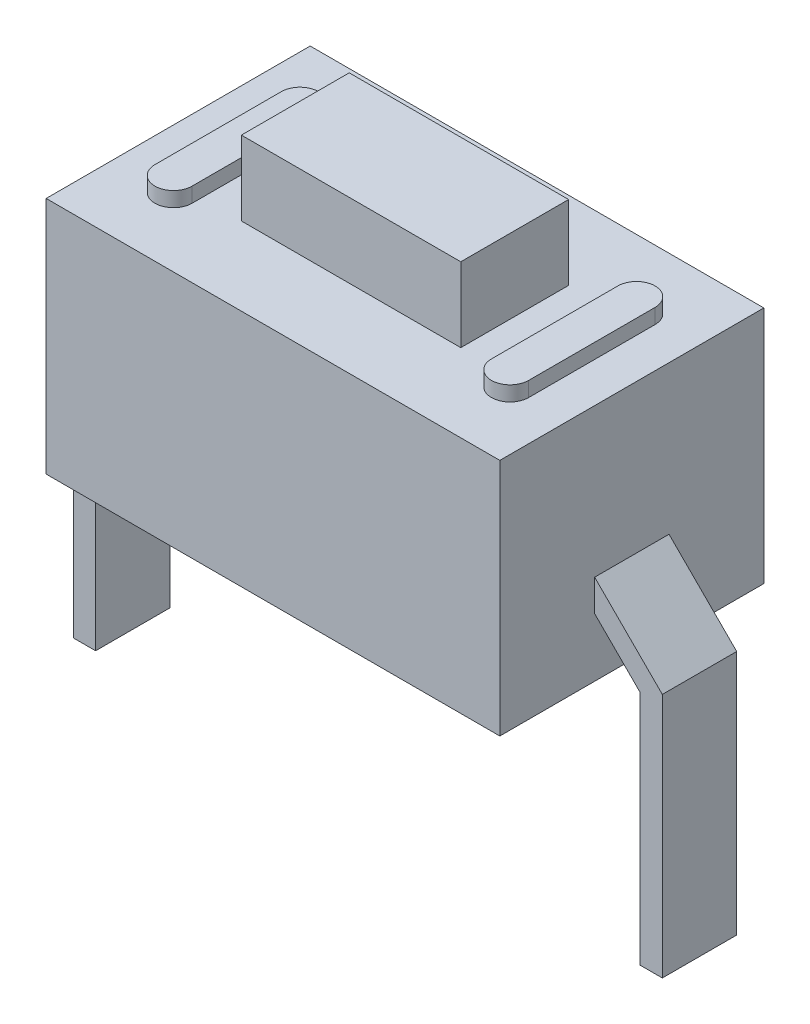
ISO-10303-21;
HEADER;
FILE_DESCRIPTION(('STEP AP214'),'2;1');
FILE_NAME('part.step','',(''),(''),'','','');
FILE_SCHEMA(('AUTOMOTIVE_DESIGN { 1 0 10303 214 1 1 1 1 }'));
ENDSEC;
DATA;
#1=APPLICATION_CONTEXT('core data for automotive mechanical design processes');
#2=APPLICATION_PROTOCOL_DEFINITION('international standard','automotive_design',2000,#1);
#3=PRODUCT_CONTEXT('',#1,'mechanical');
#4=PRODUCT('Part','Part','',(#3));
#5=PRODUCT_RELATED_PRODUCT_CATEGORY('part','',(#4));
#6=PRODUCT_DEFINITION_FORMATION('','',#4);
#7=PRODUCT_DEFINITION_CONTEXT('part definition',#1,'design');
#8=PRODUCT_DEFINITION('design','',#6,#7);
#9=PRODUCT_DEFINITION_SHAPE('','',#8);
#10=(LENGTH_UNIT() NAMED_UNIT(*) SI_UNIT(.MILLI.,.METRE.));
#11=(NAMED_UNIT(*) PLANE_ANGLE_UNIT() SI_UNIT($,.RADIAN.));
#12=(NAMED_UNIT(*) SI_UNIT($,.STERADIAN.) SOLID_ANGLE_UNIT());
#13=UNCERTAINTY_MEASURE_WITH_UNIT(LENGTH_MEASURE(1.E-05),#10,'distance_accuracy_value','');
#14=(GEOMETRIC_REPRESENTATION_CONTEXT(3) GLOBAL_UNCERTAINTY_ASSIGNED_CONTEXT((#13)) GLOBAL_UNIT_ASSIGNED_CONTEXT((#10,
#11,#12)) REPRESENTATION_CONTEXT('',''));
#15=CARTESIAN_POINT('',(0.,0.,0.));
#16=DIRECTION('',(0.,0.,1.));
#17=DIRECTION('',(1.,0.,0.));
#18=AXIS2_PLACEMENT_3D('',#15,#16,#17);
#19=CARTESIAN_POINT('',(-3.05,3.21,-1.775));
#20=DIRECTION('',(1.,0.,0.));
#21=DIRECTION('',(0.,0.,-1.));
#22=AXIS2_PLACEMENT_3D('',#19,#20,#21);
#23=PLANE('',#22);
#24=DIRECTION('',(0.,0.,1.));
#25=VECTOR('',#24,1.);
#26=CARTESIAN_POINT('',(-3.05,0.,-1.775));
#27=LINE('',#26,#25);
#28=CARTESIAN_POINT('',(-3.05,0.,-1.775));
#29=VERTEX_POINT('',#28);
#30=CARTESIAN_POINT('',(-3.05,0.,1.775));
#31=VERTEX_POINT('',#30);
#32=EDGE_CURVE('E408',#29,#31,#27,.T.);
#33=ORIENTED_EDGE('',*,*,#32,.T.);
#34=DIRECTION('',(0.,-1.,0.));
#35=VECTOR('',#34,1.);
#36=CARTESIAN_POINT('',(-3.05,3.21,1.775));
#37=LINE('',#36,#35);
#38=CARTESIAN_POINT('',(-3.05,3.21,1.775));
#39=VERTEX_POINT('',#38);
#40=EDGE_CURVE('E413',#39,#31,#37,.T.);
#41=ORIENTED_EDGE('',*,*,#40,.F.);
#42=DIRECTION('',(0.,0.,1.));
#43=VECTOR('',#42,1.);
#44=CARTESIAN_POINT('',(-3.05,3.21,-1.775));
#45=LINE('',#44,#43);
#46=CARTESIAN_POINT('',(-3.05,3.21,-1.775));
#47=VERTEX_POINT('',#46);
#48=EDGE_CURVE('E399',#47,#39,#45,.T.);
#49=ORIENTED_EDGE('',*,*,#48,.F.);
#50=DIRECTION('',(0.,-1.,0.));
#51=VECTOR('',#50,1.);
#52=CARTESIAN_POINT('',(-3.05,3.21,-1.775));
#53=LINE('',#52,#51);
#54=EDGE_CURVE('E416',#47,#29,#53,.T.);
#55=ORIENTED_EDGE('',*,*,#54,.T.);
#56=EDGE_LOOP('',(#33,#41,#49,#55));
#57=FACE_BOUND('',#56,.T.);
#58=DIRECTION('',(0.,1.,0.));
#59=VECTOR('',#58,1.);
#60=CARTESIAN_POINT('',(-3.05,3.21,0.5));
#61=LINE('',#60,#59);
#62=CARTESIAN_POINT('',(-3.05,0.787867965644037,0.5));
#63=VERTEX_POINT('',#62);
#64=CARTESIAN_POINT('',(-3.05,1.21213203435596,0.5));
#65=VERTEX_POINT('',#64);
#66=EDGE_CURVE('E11',#63,#65,#61,.T.);
#67=ORIENTED_EDGE('',*,*,#66,.F.);
#68=DIRECTION('',(0.,0.,-1.));
#69=VECTOR('',#68,1.);
#70=CARTESIAN_POINT('',(-3.05,0.787867965644036,-1.775));
#71=LINE('',#70,#69);
#72=CARTESIAN_POINT('',(-3.05,0.787867965644036,-0.5));
#73=VERTEX_POINT('',#72);
#74=EDGE_CURVE('E45',#63,#73,#71,.T.);
#75=ORIENTED_EDGE('',*,*,#74,.T.);
#76=DIRECTION('',(0.,1.,0.));
#77=VECTOR('',#76,1.);
#78=CARTESIAN_POINT('',(-3.05,3.21,-0.5));
#79=LINE('',#78,#77);
#80=CARTESIAN_POINT('',(-3.05,1.21213203435596,-0.5));
#81=VERTEX_POINT('',#80);
#82=EDGE_CURVE('E432',#73,#81,#79,.T.);
#83=ORIENTED_EDGE('',*,*,#82,.T.);
#84=DIRECTION('',(0.,0.,-1.));
#85=VECTOR('',#84,1.);
#86=CARTESIAN_POINT('',(-3.05,1.21213203435596,-1.775));
#87=LINE('',#86,#85);
#88=EDGE_CURVE('E435',#65,#81,#87,.T.);
#89=ORIENTED_EDGE('',*,*,#88,.F.);
#90=EDGE_LOOP('',(#67,#75,#83,#89));
#91=FACE_BOUND('',#90,.T.);
#92=ADVANCED_FACE('F37',(#57,#91),#23,.F.);
#93=CARTESIAN_POINT('',(3.05,3.21,-1.775));
#94=DIRECTION('',(-1.,0.,0.));
#95=DIRECTION('',(0.,0.,1.));
#96=AXIS2_PLACEMENT_3D('',#93,#94,#95);
#97=PLANE('',#96);
#98=DIRECTION('',(0.,0.,-1.));
#99=VECTOR('',#98,1.);
#100=CARTESIAN_POINT('',(3.05,0.,-1.775));
#101=LINE('',#100,#99);
#102=CARTESIAN_POINT('',(3.05,0.,1.775));
#103=VERTEX_POINT('',#102);
#104=CARTESIAN_POINT('',(3.05,0.,-1.775));
#105=VERTEX_POINT('',#104);
#106=EDGE_CURVE('E392',#103,#105,#101,.T.);
#107=ORIENTED_EDGE('',*,*,#106,.T.);
#108=DIRECTION('',(0.,-1.,0.));
#109=VECTOR('',#108,1.);
#110=CARTESIAN_POINT('',(3.05,3.21,-1.775));
#111=LINE('',#110,#109);
#112=CARTESIAN_POINT('',(3.05,3.21,-1.775));
#113=VERTEX_POINT('',#112);
#114=EDGE_CURVE('E419',#113,#105,#111,.T.);
#115=ORIENTED_EDGE('',*,*,#114,.F.);
#116=DIRECTION('',(0.,0.,-1.));
#117=VECTOR('',#116,1.);
#118=CARTESIAN_POINT('',(3.05,3.21,-1.775));
#119=LINE('',#118,#117);
#120=CARTESIAN_POINT('',(3.05,3.21,1.775));
#121=VERTEX_POINT('',#120);
#122=EDGE_CURVE('E393',#121,#113,#119,.T.);
#123=ORIENTED_EDGE('',*,*,#122,.F.);
#124=DIRECTION('',(0.,-1.,0.));
#125=VECTOR('',#124,1.);
#126=CARTESIAN_POINT('',(3.05,3.21,1.775));
#127=LINE('',#126,#125);
#128=EDGE_CURVE('E403',#121,#103,#127,.T.);
#129=ORIENTED_EDGE('',*,*,#128,.T.);
#130=EDGE_LOOP('',(#107,#115,#123,#129));
#131=FACE_BOUND('',#130,.T.);
#132=DIRECTION('',(0.,-1.,0.));
#133=VECTOR('',#132,1.);
#134=CARTESIAN_POINT('',(3.05,3.21,0.5));
#135=LINE('',#134,#133);
#136=CARTESIAN_POINT('',(3.05,1.21213203435596,0.5));
#137=VERTEX_POINT('',#136);
#138=CARTESIAN_POINT('',(3.05,0.787867965644037,0.5));
#139=VERTEX_POINT('',#138);
#140=EDGE_CURVE('E430',#137,#139,#135,.T.);
#141=ORIENTED_EDGE('',*,*,#140,.F.);
#142=DIRECTION('',(0.,0.,-1.));
#143=VECTOR('',#142,1.);
#144=CARTESIAN_POINT('',(3.05,1.21213203435596,-1.775));
#145=LINE('',#144,#143);
#146=CARTESIAN_POINT('',(3.05,1.21213203435596,-0.5));
#147=VERTEX_POINT('',#146);
#148=EDGE_CURVE('E427',#137,#147,#145,.T.);
#149=ORIENTED_EDGE('',*,*,#148,.T.);
#150=DIRECTION('',(0.,-1.,0.));
#151=VECTOR('',#150,1.);
#152=CARTESIAN_POINT('',(3.05,3.21,-0.5));
#153=LINE('',#152,#151);
#154=CARTESIAN_POINT('',(3.05,0.787867965644037,-0.5));
#155=VERTEX_POINT('',#154);
#156=EDGE_CURVE('E422',#147,#155,#153,.T.);
#157=ORIENTED_EDGE('',*,*,#156,.T.);
#158=DIRECTION('',(0.,0.,-1.));
#159=VECTOR('',#158,1.);
#160=CARTESIAN_POINT('',(3.05,0.787867965644038,-1.775));
#161=LINE('',#160,#159);
#162=EDGE_CURVE('E425',#139,#155,#161,.T.);
#163=ORIENTED_EDGE('',*,*,#162,.F.);
#164=EDGE_LOOP('',(#141,#149,#157,#163));
#165=FACE_BOUND('',#164,.T.);
#166=ADVANCED_FACE('F39',(#131,#165),#97,.F.);
#167=CARTESIAN_POINT('',(0.,3.21,0.));
#168=DIRECTION('',(0.,1.,0.));
#169=DIRECTION('',(0.,0.,1.));
#170=AXIS2_PLACEMENT_3D('',#167,#168,#169);
#171=PLANE('',#170);
#172=DIRECTION('',(0.,0.,-1.));
#173=VECTOR('',#172,1.);
#174=CARTESIAN_POINT('',(1.475,3.21,-0.725));
#175=LINE('',#174,#173);
#176=CARTESIAN_POINT('',(1.475,3.21,0.725));
#177=VERTEX_POINT('',#176);
#178=CARTESIAN_POINT('',(1.475,3.21,-0.725));
#179=VERTEX_POINT('',#178);
#180=EDGE_CURVE('E359',#177,#179,#175,.T.);
#181=ORIENTED_EDGE('',*,*,#180,.F.);
#182=DIRECTION('',(1.,0.,0.));
#183=VECTOR('',#182,1.);
#184=CARTESIAN_POINT('',(-1.475,3.21,0.725));
#185=LINE('',#184,#183);
#186=CARTESIAN_POINT('',(-1.475,3.21,0.725));
#187=VERTEX_POINT('',#186);
#188=EDGE_CURVE('E364',#187,#177,#185,.T.);
#189=ORIENTED_EDGE('',*,*,#188,.F.);
#190=DIRECTION('',(0.,0.,1.));
#191=VECTOR('',#190,1.);
#192=CARTESIAN_POINT('',(-1.475,3.21,-0.725));
#193=LINE('',#192,#191);
#194=CARTESIAN_POINT('',(-1.475,3.21,-0.725));
#195=VERTEX_POINT('',#194);
#196=EDGE_CURVE('E376',#195,#187,#193,.T.);
#197=ORIENTED_EDGE('',*,*,#196,.F.);
#198=DIRECTION('',(-1.,0.,0.));
#199=VECTOR('',#198,1.);
#200=CARTESIAN_POINT('',(-1.475,3.21,-0.725));
#201=LINE('',#200,#199);
#202=EDGE_CURVE('E373',#179,#195,#201,.T.);
#203=ORIENTED_EDGE('',*,*,#202,.F.);
#204=EDGE_LOOP('',(#181,#189,#197,#203));
#205=FACE_BOUND('',#204,.T.);
#206=ORIENTED_EDGE('',*,*,#122,.T.);
#207=DIRECTION('',(-1.,0.,0.));
#208=VECTOR('',#207,1.);
#209=CARTESIAN_POINT('',(-3.05,3.21,-1.775));
#210=LINE('',#209,#208);
#211=EDGE_CURVE('E396',#113,#47,#210,.T.);
#212=ORIENTED_EDGE('',*,*,#211,.T.);
#213=ORIENTED_EDGE('',*,*,#48,.T.);
#214=DIRECTION('',(1.,0.,0.));
#215=VECTOR('',#214,1.);
#216=CARTESIAN_POINT('',(-3.05,3.21,1.775));
#217=LINE('',#216,#215);
#218=EDGE_CURVE('E401',#39,#121,#217,.T.);
#219=ORIENTED_EDGE('',*,*,#218,.T.);
#220=EDGE_LOOP('',(#206,#212,#213,#219));
#221=FACE_BOUND('',#220,.T.);
#222=DIRECTION('',(0.,0.,1.));
#223=VECTOR('',#222,1.);
#224=CARTESIAN_POINT('',(-2.5125,3.21,-0.85));
#225=LINE('',#224,#223);
#226=CARTESIAN_POINT('',(-2.5125,3.21,-0.85));
#227=VERTEX_POINT('',#226);
#228=CARTESIAN_POINT('',(-2.5125,3.21,0.85));
#229=VERTEX_POINT('',#228);
#230=EDGE_CURVE('E344',#227,#229,#225,.T.);
#231=ORIENTED_EDGE('',*,*,#230,.F.);
#232=CARTESIAN_POINT('',(-2.2625,3.21,-0.85));
#233=DIRECTION('',(0.,1.,0.));
#234=DIRECTION('',(0.,0.,1.));
#235=AXIS2_PLACEMENT_3D('',#232,#233,#234);
#236=CIRCLE('',#235,0.25);
#237=CARTESIAN_POINT('',(-2.0125,3.21,-0.85));
#238=VERTEX_POINT('',#237);
#239=EDGE_CURVE('E330',#238,#227,#236,.T.);
#240=ORIENTED_EDGE('',*,*,#239,.F.);
#241=DIRECTION('',(0.,0.,-1.));
#242=VECTOR('',#241,1.);
#243=CARTESIAN_POINT('',(-2.0125,3.21,-0.85));
#244=LINE('',#243,#242);
#245=CARTESIAN_POINT('',(-2.0125,3.21,0.85));
#246=VERTEX_POINT('',#245);
#247=EDGE_CURVE('E335',#246,#238,#244,.T.);
#248=ORIENTED_EDGE('',*,*,#247,.F.);
#249=CARTESIAN_POINT('',(-2.2625,3.21,0.85));
#250=DIRECTION('',(0.,1.,0.));
#251=DIRECTION('',(0.,0.,1.));
#252=AXIS2_PLACEMENT_3D('',#249,#250,#251);
#253=CIRCLE('',#252,0.25);
#254=EDGE_CURVE('E346',#229,#246,#253,.T.);
#255=ORIENTED_EDGE('',*,*,#254,.F.);
#256=EDGE_LOOP('',(#231,#240,#248,#255));
#257=FACE_BOUND('',#256,.T.);
#258=DIRECTION('',(0.,0.,1.));
#259=VECTOR('',#258,1.);
#260=CARTESIAN_POINT('',(2.0125,3.21,-0.85));
#261=LINE('',#260,#259);
#262=CARTESIAN_POINT('',(2.0125,3.21,-0.85));
#263=VERTEX_POINT('',#262);
#264=CARTESIAN_POINT('',(2.0125,3.21,0.85));
#265=VERTEX_POINT('',#264);
#266=EDGE_CURVE('E315',#263,#265,#261,.T.);
#267=ORIENTED_EDGE('',*,*,#266,.F.);
#268=CARTESIAN_POINT('',(2.2625,3.21,-0.85));
#269=DIRECTION('',(0.,1.,0.));
#270=DIRECTION('',(0.,0.,-1.));
#271=AXIS2_PLACEMENT_3D('',#268,#269,#270);
#272=CIRCLE('',#271,0.25);
#273=CARTESIAN_POINT('',(2.5125,3.21,-0.85));
#274=VERTEX_POINT('',#273);
#275=EDGE_CURVE('E301',#274,#263,#272,.T.);
#276=ORIENTED_EDGE('',*,*,#275,.F.);
#277=DIRECTION('',(0.,0.,-1.));
#278=VECTOR('',#277,1.);
#279=CARTESIAN_POINT('',(2.5125,3.21,-0.85));
#280=LINE('',#279,#278);
#281=CARTESIAN_POINT('',(2.5125,3.21,0.85));
#282=VERTEX_POINT('',#281);
#283=EDGE_CURVE('E306',#282,#274,#280,.T.);
#284=ORIENTED_EDGE('',*,*,#283,.F.);
#285=CARTESIAN_POINT('',(2.2625,3.21,0.85));
#286=DIRECTION('',(0.,1.,0.));
#287=DIRECTION('',(0.,0.,-1.));
#288=AXIS2_PLACEMENT_3D('',#285,#286,#287);
#289=CIRCLE('',#288,0.25);
#290=EDGE_CURVE('E317',#265,#282,#289,.T.);
#291=ORIENTED_EDGE('',*,*,#290,.F.);
#292=EDGE_LOOP('',(#267,#276,#284,#291));
#293=FACE_BOUND('',#292,.T.);
#294=ADVANCED_FACE('F464',(#205,#221,#257,#293),#171,.T.);
#295=CARTESIAN_POINT('',(-3.05,3.21,-1.775));
#296=DIRECTION('',(0.,0.,1.));
#297=DIRECTION('',(1.,0.,0.));
#298=AXIS2_PLACEMENT_3D('',#295,#296,#297);
#299=PLANE('',#298);
#300=DIRECTION('',(-1.,0.,0.));
#301=VECTOR('',#300,1.);
#302=CARTESIAN_POINT('',(-3.05,0.,-1.775));
#303=LINE('',#302,#301);
#304=EDGE_CURVE('E406',#105,#29,#303,.T.);
#305=ORIENTED_EDGE('',*,*,#304,.T.);
#306=ORIENTED_EDGE('',*,*,#54,.F.);
#307=ORIENTED_EDGE('',*,*,#211,.F.);
#308=ORIENTED_EDGE('',*,*,#114,.T.);
#309=EDGE_LOOP('',(#305,#306,#307,#308));
#310=FACE_BOUND('',#309,.T.);
#311=ADVANCED_FACE('F469',(#310),#299,.F.);
#312=CARTESIAN_POINT('',(-3.05,3.21,1.775));
#313=DIRECTION('',(0.,0.,-1.));
#314=DIRECTION('',(-1.,0.,0.));
#315=AXIS2_PLACEMENT_3D('',#312,#313,#314);
#316=PLANE('',#315);
#317=DIRECTION('',(1.,0.,0.));
#318=VECTOR('',#317,1.);
#319=CARTESIAN_POINT('',(-3.05,0.,1.775));
#320=LINE('',#319,#318);
#321=EDGE_CURVE('E397',#31,#103,#320,.T.);
#322=ORIENTED_EDGE('',*,*,#321,.T.);
#323=ORIENTED_EDGE('',*,*,#128,.F.);
#324=ORIENTED_EDGE('',*,*,#218,.F.);
#325=ORIENTED_EDGE('',*,*,#40,.T.);
#326=EDGE_LOOP('',(#322,#323,#324,#325));
#327=FACE_BOUND('',#326,.T.);
#328=ADVANCED_FACE('F467',(#327),#316,.F.);
#329=CARTESIAN_POINT('',(0.,0.,0.));
#330=DIRECTION('',(0.,1.,0.));
#331=DIRECTION('',(0.,0.,1.));
#332=AXIS2_PLACEMENT_3D('',#329,#330,#331);
#333=PLANE('',#332);
#334=ORIENTED_EDGE('',*,*,#106,.F.);
#335=ORIENTED_EDGE('',*,*,#321,.F.);
#336=ORIENTED_EDGE('',*,*,#32,.F.);
#337=ORIENTED_EDGE('',*,*,#304,.F.);
#338=EDGE_LOOP('',(#334,#335,#336,#337));
#339=FACE_BOUND('',#338,.T.);
#340=ADVANCED_FACE('F476',(#339),#333,.F.);
#341=CARTESIAN_POINT('',(1.475,4.21,-0.725));
#342=DIRECTION('',(-1.,0.,0.));
#343=DIRECTION('',(0.,0.,1.));
#344=AXIS2_PLACEMENT_3D('',#341,#342,#343);
#345=PLANE('',#344);
#346=ORIENTED_EDGE('',*,*,#180,.T.);
#347=DIRECTION('',(0.,-1.,0.));
#348=VECTOR('',#347,1.);
#349=CARTESIAN_POINT('',(1.475,4.21,-0.725));
#350=LINE('',#349,#348);
#351=CARTESIAN_POINT('',(1.475,4.21,-0.725));
#352=VERTEX_POINT('',#351);
#353=EDGE_CURVE('E389',#352,#179,#350,.T.);
#354=ORIENTED_EDGE('',*,*,#353,.F.);
#355=DIRECTION('',(0.,0.,-1.));
#356=VECTOR('',#355,1.);
#357=CARTESIAN_POINT('',(1.475,4.21,-0.725));
#358=LINE('',#357,#356);
#359=CARTESIAN_POINT('',(1.475,4.21,0.725));
#360=VERTEX_POINT('',#359);
#361=EDGE_CURVE('E360',#360,#352,#358,.T.);
#362=ORIENTED_EDGE('',*,*,#361,.F.);
#363=DIRECTION('',(0.,-1.,0.));
#364=VECTOR('',#363,1.);
#365=CARTESIAN_POINT('',(1.475,4.21,0.725));
#366=LINE('',#365,#364);
#367=EDGE_CURVE('E370',#360,#177,#366,.T.);
#368=ORIENTED_EDGE('',*,*,#367,.T.);
#369=EDGE_LOOP('',(#346,#354,#362,#368));
#370=FACE_BOUND('',#369,.T.);
#371=ADVANCED_FACE('F569',(#370),#345,.F.);
#372=CARTESIAN_POINT('',(-1.475,4.21,-0.725));
#373=DIRECTION('',(0.,0.,1.));
#374=DIRECTION('',(1.,0.,0.));
#375=AXIS2_PLACEMENT_3D('',#372,#373,#374);
#376=PLANE('',#375);
#377=ORIENTED_EDGE('',*,*,#202,.T.);
#378=DIRECTION('',(0.,-1.,0.));
#379=VECTOR('',#378,1.);
#380=CARTESIAN_POINT('',(-1.475,4.21,-0.725));
#381=LINE('',#380,#379);
#382=CARTESIAN_POINT('',(-1.475,4.21,-0.725));
#383=VERTEX_POINT('',#382);
#384=EDGE_CURVE('E386',#383,#195,#381,.T.);
#385=ORIENTED_EDGE('',*,*,#384,.F.);
#386=DIRECTION('',(-1.,0.,0.));
#387=VECTOR('',#386,1.);
#388=CARTESIAN_POINT('',(-1.475,4.21,-0.725));
#389=LINE('',#388,#387);
#390=EDGE_CURVE('E363',#352,#383,#389,.T.);
#391=ORIENTED_EDGE('',*,*,#390,.F.);
#392=ORIENTED_EDGE('',*,*,#353,.T.);
#393=EDGE_LOOP('',(#377,#385,#391,#392));
#394=FACE_BOUND('',#393,.T.);
#395=ADVANCED_FACE('F565',(#394),#376,.F.);
#396=CARTESIAN_POINT('',(-1.475,4.21,-0.725));
#397=DIRECTION('',(1.,0.,0.));
#398=DIRECTION('',(0.,0.,-1.));
#399=AXIS2_PLACEMENT_3D('',#396,#397,#398);
#400=PLANE('',#399);
#401=ORIENTED_EDGE('',*,*,#196,.T.);
#402=DIRECTION('',(0.,-1.,0.));
#403=VECTOR('',#402,1.);
#404=CARTESIAN_POINT('',(-1.475,4.21,0.725));
#405=LINE('',#404,#403);
#406=CARTESIAN_POINT('',(-1.475,4.21,0.725));
#407=VERTEX_POINT('',#406);
#408=EDGE_CURVE('E383',#407,#187,#405,.T.);
#409=ORIENTED_EDGE('',*,*,#408,.F.);
#410=DIRECTION('',(0.,0.,1.));
#411=VECTOR('',#410,1.);
#412=CARTESIAN_POINT('',(-1.475,4.21,-0.725));
#413=LINE('',#412,#411);
#414=EDGE_CURVE('E366',#383,#407,#413,.T.);
#415=ORIENTED_EDGE('',*,*,#414,.F.);
#416=ORIENTED_EDGE('',*,*,#384,.T.);
#417=EDGE_LOOP('',(#401,#409,#415,#416));
#418=FACE_BOUND('',#417,.T.);
#419=ADVANCED_FACE('F561',(#418),#400,.F.);
#420=CARTESIAN_POINT('',(-1.475,4.21,0.725));
#421=DIRECTION('',(0.,0.,-1.));
#422=DIRECTION('',(-1.,0.,0.));
#423=AXIS2_PLACEMENT_3D('',#420,#421,#422);
#424=PLANE('',#423);
#425=ORIENTED_EDGE('',*,*,#188,.T.);
#426=ORIENTED_EDGE('',*,*,#367,.F.);
#427=DIRECTION('',(1.,0.,0.));
#428=VECTOR('',#427,1.);
#429=CARTESIAN_POINT('',(-1.475,4.21,0.725));
#430=LINE('',#429,#428);
#431=EDGE_CURVE('E368',#407,#360,#430,.T.);
#432=ORIENTED_EDGE('',*,*,#431,.F.);
#433=ORIENTED_EDGE('',*,*,#408,.T.);
#434=EDGE_LOOP('',(#425,#426,#432,#433));
#435=FACE_BOUND('',#434,.T.);
#436=ADVANCED_FACE('F557',(#435),#424,.F.);
#437=CARTESIAN_POINT('',(0.,4.21,0.));
#438=DIRECTION('',(0.,1.,0.));
#439=DIRECTION('',(0.,0.,1.));
#440=AXIS2_PLACEMENT_3D('',#437,#438,#439);
#441=PLANE('',#440);
#442=ORIENTED_EDGE('',*,*,#361,.T.);
#443=ORIENTED_EDGE('',*,*,#390,.T.);
#444=ORIENTED_EDGE('',*,*,#414,.T.);
#445=ORIENTED_EDGE('',*,*,#431,.T.);
#446=EDGE_LOOP('',(#442,#443,#444,#445));
#447=FACE_BOUND('',#446,.T.);
#448=ADVANCED_FACE('F553',(#447),#441,.T.);
#449=CARTESIAN_POINT('',(-2.2625,3.41,-0.85));
#450=DIRECTION('',(0.,-1.,0.));
#451=DIRECTION('',(0.,0.,-1.));
#452=AXIS2_PLACEMENT_3D('',#449,#450,#451);
#453=CYLINDRICAL_SURFACE('',#452,0.25);
#454=ORIENTED_EDGE('',*,*,#239,.T.);
#455=DIRECTION('',(0.,-1.,0.));
#456=VECTOR('',#455,1.);
#457=CARTESIAN_POINT('',(-2.5125,3.41,-0.85));
#458=LINE('',#457,#456);
#459=CARTESIAN_POINT('',(-2.5125,3.41,-0.85));
#460=VERTEX_POINT('',#459);
#461=EDGE_CURVE('E357',#460,#227,#458,.T.);
#462=ORIENTED_EDGE('',*,*,#461,.F.);
#463=CARTESIAN_POINT('',(-2.2625,3.41,-0.85));
#464=DIRECTION('',(0.,1.,0.));
#465=DIRECTION('',(0.,0.,1.));
#466=AXIS2_PLACEMENT_3D('',#463,#464,#465);
#467=CIRCLE('',#466,0.25);
#468=CARTESIAN_POINT('',(-2.0125,3.41,-0.85));
#469=VERTEX_POINT('',#468);
#470=EDGE_CURVE('E331',#469,#460,#467,.T.);
#471=ORIENTED_EDGE('',*,*,#470,.F.);
#472=DIRECTION('',(0.,-1.,0.));
#473=VECTOR('',#472,1.);
#474=CARTESIAN_POINT('',(-2.0125,3.41,-0.85));
#475=LINE('',#474,#473);
#476=EDGE_CURVE('E341',#469,#238,#475,.T.);
#477=ORIENTED_EDGE('',*,*,#476,.T.);
#478=EDGE_LOOP('',(#454,#462,#471,#477));
#479=FACE_BOUND('',#478,.T.);
#480=ADVANCED_FACE('F549',(#479),#453,.T.);
#481=CARTESIAN_POINT('',(-2.5125,3.41,-0.85));
#482=DIRECTION('',(1.,0.,0.));
#483=DIRECTION('',(0.,0.,-1.));
#484=AXIS2_PLACEMENT_3D('',#481,#482,#483);
#485=PLANE('',#484);
#486=ORIENTED_EDGE('',*,*,#230,.T.);
#487=DIRECTION('',(0.,-1.,0.));
#488=VECTOR('',#487,1.);
#489=CARTESIAN_POINT('',(-2.5125,3.41,0.85));
#490=LINE('',#489,#488);
#491=CARTESIAN_POINT('',(-2.5125,3.41,0.85));
#492=VERTEX_POINT('',#491);
#493=EDGE_CURVE('E354',#492,#229,#490,.T.);
#494=ORIENTED_EDGE('',*,*,#493,.F.);
#495=DIRECTION('',(0.,0.,1.));
#496=VECTOR('',#495,1.);
#497=CARTESIAN_POINT('',(-2.5125,3.41,-0.85));
#498=LINE('',#497,#496);
#499=EDGE_CURVE('E334',#460,#492,#498,.T.);
#500=ORIENTED_EDGE('',*,*,#499,.F.);
#501=ORIENTED_EDGE('',*,*,#461,.T.);
#502=EDGE_LOOP('',(#486,#494,#500,#501));
#503=FACE_BOUND('',#502,.T.);
#504=ADVANCED_FACE('F545',(#503),#485,.F.);
#505=CARTESIAN_POINT('',(-2.2625,3.41,0.85));
#506=DIRECTION('',(0.,-1.,0.));
#507=DIRECTION('',(0.,0.,-1.));
#508=AXIS2_PLACEMENT_3D('',#505,#506,#507);
#509=CYLINDRICAL_SURFACE('',#508,0.25);
#510=ORIENTED_EDGE('',*,*,#254,.T.);
#511=DIRECTION('',(0.,-1.,0.));
#512=VECTOR('',#511,1.);
#513=CARTESIAN_POINT('',(-2.0125,3.41,0.85));
#514=LINE('',#513,#512);
#515=CARTESIAN_POINT('',(-2.0125,3.41,0.85));
#516=VERTEX_POINT('',#515);
#517=EDGE_CURVE('E352',#516,#246,#514,.T.);
#518=ORIENTED_EDGE('',*,*,#517,.F.);
#519=CARTESIAN_POINT('',(-2.2625,3.41,0.85));
#520=DIRECTION('',(0.,1.,0.));
#521=DIRECTION('',(0.,0.,1.));
#522=AXIS2_PLACEMENT_3D('',#519,#520,#521);
#523=CIRCLE('',#522,0.25);
#524=EDGE_CURVE('E337',#492,#516,#523,.T.);
#525=ORIENTED_EDGE('',*,*,#524,.F.);
#526=ORIENTED_EDGE('',*,*,#493,.T.);
#527=EDGE_LOOP('',(#510,#518,#525,#526));
#528=FACE_BOUND('',#527,.T.);
#529=ADVANCED_FACE('F541',(#528),#509,.T.);
#530=CARTESIAN_POINT('',(-2.0125,3.41,-0.85));
#531=DIRECTION('',(-1.,0.,0.));
#532=DIRECTION('',(0.,0.,1.));
#533=AXIS2_PLACEMENT_3D('',#530,#531,#532);
#534=PLANE('',#533);
#535=ORIENTED_EDGE('',*,*,#247,.T.);
#536=ORIENTED_EDGE('',*,*,#476,.F.);
#537=DIRECTION('',(0.,0.,-1.));
#538=VECTOR('',#537,1.);
#539=CARTESIAN_POINT('',(-2.0125,3.41,-0.85));
#540=LINE('',#539,#538);
#541=EDGE_CURVE('E339',#516,#469,#540,.T.);
#542=ORIENTED_EDGE('',*,*,#541,.F.);
#543=ORIENTED_EDGE('',*,*,#517,.T.);
#544=EDGE_LOOP('',(#535,#536,#542,#543));
#545=FACE_BOUND('',#544,.T.);
#546=ADVANCED_FACE('F537',(#545),#534,.F.);
#547=CARTESIAN_POINT('',(-2.2625,3.41,-0.85));
#548=DIRECTION('',(0.,1.,0.));
#549=DIRECTION('',(0.,0.,1.));
#550=AXIS2_PLACEMENT_3D('',#547,#548,#549);
#551=PLANE('',#550);
#552=ORIENTED_EDGE('',*,*,#470,.T.);
#553=ORIENTED_EDGE('',*,*,#499,.T.);
#554=ORIENTED_EDGE('',*,*,#524,.T.);
#555=ORIENTED_EDGE('',*,*,#541,.T.);
#556=EDGE_LOOP('',(#552,#553,#554,#555));
#557=FACE_BOUND('',#556,.T.);
#558=ADVANCED_FACE('F534',(#557),#551,.T.);
#559=CARTESIAN_POINT('',(2.2625,3.41,-0.85));
#560=DIRECTION('',(0.,-1.,0.));
#561=DIRECTION('',(0.,0.,-1.));
#562=AXIS2_PLACEMENT_3D('',#559,#560,#561);
#563=CYLINDRICAL_SURFACE('',#562,0.25);
#564=ORIENTED_EDGE('',*,*,#275,.T.);
#565=DIRECTION('',(0.,-1.,0.));
#566=VECTOR('',#565,1.);
#567=CARTESIAN_POINT('',(2.0125,3.41,-0.85));
#568=LINE('',#567,#566);
#569=CARTESIAN_POINT('',(2.0125,3.41,-0.85));
#570=VERTEX_POINT('',#569);
#571=EDGE_CURVE('E328',#570,#263,#568,.T.);
#572=ORIENTED_EDGE('',*,*,#571,.F.);
#573=CARTESIAN_POINT('',(2.2625,3.41,-0.85));
#574=DIRECTION('',(0.,1.,0.));
#575=DIRECTION('',(0.,0.,-1.));
#576=AXIS2_PLACEMENT_3D('',#573,#574,#575);
#577=CIRCLE('',#576,0.25);
#578=CARTESIAN_POINT('',(2.5125,3.41,-0.85));
#579=VERTEX_POINT('',#578);
#580=EDGE_CURVE('E302',#579,#570,#577,.T.);
#581=ORIENTED_EDGE('',*,*,#580,.F.);
#582=DIRECTION('',(0.,-1.,0.));
#583=VECTOR('',#582,1.);
#584=CARTESIAN_POINT('',(2.5125,3.41,-0.85));
#585=LINE('',#584,#583);
#586=EDGE_CURVE('E312',#579,#274,#585,.T.);
#587=ORIENTED_EDGE('',*,*,#586,.T.);
#588=EDGE_LOOP('',(#564,#572,#581,#587));
#589=FACE_BOUND('',#588,.T.);
#590=ADVANCED_FACE('F516',(#589),#563,.T.);
#591=CARTESIAN_POINT('',(2.0125,3.41,-0.85));
#592=DIRECTION('',(1.,0.,0.));
#593=DIRECTION('',(0.,0.,-1.));
#594=AXIS2_PLACEMENT_3D('',#591,#592,#593);
#595=PLANE('',#594);
#596=ORIENTED_EDGE('',*,*,#266,.T.);
#597=DIRECTION('',(0.,-1.,0.));
#598=VECTOR('',#597,1.);
#599=CARTESIAN_POINT('',(2.0125,3.41,0.85));
#600=LINE('',#599,#598);
#601=CARTESIAN_POINT('',(2.0125,3.41,0.85));
#602=VERTEX_POINT('',#601);
#603=EDGE_CURVE('E325',#602,#265,#600,.T.);
#604=ORIENTED_EDGE('',*,*,#603,.F.);
#605=DIRECTION('',(0.,0.,1.));
#606=VECTOR('',#605,1.);
#607=CARTESIAN_POINT('',(2.0125,3.41,-0.85));
#608=LINE('',#607,#606);
#609=EDGE_CURVE('E305',#570,#602,#608,.T.);
#610=ORIENTED_EDGE('',*,*,#609,.F.);
#611=ORIENTED_EDGE('',*,*,#571,.T.);
#612=EDGE_LOOP('',(#596,#604,#610,#611));
#613=FACE_BOUND('',#612,.T.);
#614=ADVANCED_FACE('F504',(#613),#595,.F.);
#615=CARTESIAN_POINT('',(2.2625,3.41,0.85));
#616=DIRECTION('',(0.,-1.,0.));
#617=DIRECTION('',(0.,0.,-1.));
#618=AXIS2_PLACEMENT_3D('',#615,#616,#617);
#619=CYLINDRICAL_SURFACE('',#618,0.25);
#620=ORIENTED_EDGE('',*,*,#290,.T.);
#621=DIRECTION('',(0.,-1.,0.));
#622=VECTOR('',#621,1.);
#623=CARTESIAN_POINT('',(2.5125,3.41,0.85));
#624=LINE('',#623,#622);
#625=CARTESIAN_POINT('',(2.5125,3.41,0.85));
#626=VERTEX_POINT('',#625);
#627=EDGE_CURVE('E323',#626,#282,#624,.T.);
#628=ORIENTED_EDGE('',*,*,#627,.F.);
#629=CARTESIAN_POINT('',(2.2625,3.41,0.85));
#630=DIRECTION('',(0.,1.,0.));
#631=DIRECTION('',(0.,0.,-1.));
#632=AXIS2_PLACEMENT_3D('',#629,#630,#631);
#633=CIRCLE('',#632,0.25);
#634=EDGE_CURVE('E308',#602,#626,#633,.T.);
#635=ORIENTED_EDGE('',*,*,#634,.F.);
#636=ORIENTED_EDGE('',*,*,#603,.T.);
#637=EDGE_LOOP('',(#620,#628,#635,#636));
#638=FACE_BOUND('',#637,.T.);
#639=ADVANCED_FACE('F508',(#638),#619,.T.);
#640=CARTESIAN_POINT('',(2.5125,3.41,-0.85));
#641=DIRECTION('',(-1.,0.,0.));
#642=DIRECTION('',(0.,0.,1.));
#643=AXIS2_PLACEMENT_3D('',#640,#641,#642);
#644=PLANE('',#643);
#645=ORIENTED_EDGE('',*,*,#283,.T.);
#646=ORIENTED_EDGE('',*,*,#586,.F.);
#647=DIRECTION('',(0.,0.,-1.));
#648=VECTOR('',#647,1.);
#649=CARTESIAN_POINT('',(2.5125,3.41,-0.85));
#650=LINE('',#649,#648);
#651=EDGE_CURVE('E310',#626,#579,#650,.T.);
#652=ORIENTED_EDGE('',*,*,#651,.F.);
#653=ORIENTED_EDGE('',*,*,#627,.T.);
#654=EDGE_LOOP('',(#645,#646,#652,#653));
#655=FACE_BOUND('',#654,.T.);
#656=ADVANCED_FACE('F518',(#655),#644,.F.);
#657=CARTESIAN_POINT('',(2.2625,3.41,-0.85));
#658=DIRECTION('',(0.,-1.,0.));
#659=DIRECTION('',(0.,0.,-1.));
#660=AXIS2_PLACEMENT_3D('',#657,#658,#659);
#661=PLANE('',#660);
#662=ORIENTED_EDGE('',*,*,#580,.T.);
#663=ORIENTED_EDGE('',*,*,#609,.T.);
#664=ORIENTED_EDGE('',*,*,#634,.T.);
#665=ORIENTED_EDGE('',*,*,#651,.T.);
#666=EDGE_LOOP('',(#662,#663,#664,#665));
#667=FACE_BOUND('',#666,.T.);
#668=ADVANCED_FACE('F512',(#667),#661,.F.);
#669=CARTESIAN_POINT('',(2.653608324091,1.60852371026497,0.5));
#670=DIRECTION('',(0.707106781186547,0.707106781186548,0.));
#671=DIRECTION('',(-0.707106781186548,0.707106781186547,0.));
#672=AXIS2_PLACEMENT_3D('',#669,#670,#671);
#673=PLANE('',#672);
#674=ORIENTED_EDGE('',*,*,#148,.F.);
#675=DIRECTION('',(0.707106781186548,-0.707106781186547,0.));
#676=VECTOR('',#675,1.);
#677=CARTESIAN_POINT('',(2.653608324091,1.60852371026497,0.5));
#678=LINE('',#677,#676);
#679=CARTESIAN_POINT('',(3.96,0.302132034355967,0.5));
#680=VERTEX_POINT('',#679);
#681=EDGE_CURVE('E276',#137,#680,#678,.T.);
#682=ORIENTED_EDGE('',*,*,#681,.T.);
#683=DIRECTION('',(0.,0.,-1.));
#684=VECTOR('',#683,1.);
#685=CARTESIAN_POINT('',(3.96,0.302132034355967,0.5));
#686=LINE('',#685,#684);
#687=CARTESIAN_POINT('',(3.96,0.302132034355967,-0.5));
#688=VERTEX_POINT('',#687);
#689=EDGE_CURVE('E294',#680,#688,#686,.T.);
#690=ORIENTED_EDGE('',*,*,#689,.T.);
#691=DIRECTION('',(0.707106781186548,-0.707106781186547,0.));
#692=VECTOR('',#691,1.);
#693=CARTESIAN_POINT('',(2.653608324091,1.60852371026497,-0.5));
#694=LINE('',#693,#692);
#695=EDGE_CURVE('E289',#147,#688,#694,.T.);
#696=ORIENTED_EDGE('',*,*,#695,.F.);
#697=EDGE_LOOP('',(#674,#682,#690,#696));
#698=FACE_BOUND('',#697,.T.);
#699=ADVANCED_FACE('F525',(#698),#673,.T.);
#700=CARTESIAN_POINT('',(2.44147628973503,1.396391675909,0.5));
#701=DIRECTION('',(0.707106781186547,0.707106781186548,0.));
#702=DIRECTION('',(-0.707106781186548,0.707106781186547,0.));
#703=AXIS2_PLACEMENT_3D('',#700,#701,#702);
#704=PLANE('',#703);
#705=DIRECTION('',(0.707106781186548,-0.707106781186547,0.));
#706=VECTOR('',#705,1.);
#707=CARTESIAN_POINT('',(2.44147628973503,1.396391675909,0.5));
#708=LINE('',#707,#706);
#709=CARTESIAN_POINT('',(3.66,0.177867965644038,0.5));
#710=VERTEX_POINT('',#709);
#711=EDGE_CURVE('E278',#139,#710,#708,.T.);
#712=ORIENTED_EDGE('',*,*,#711,.F.);
#713=ORIENTED_EDGE('',*,*,#162,.T.);
#714=DIRECTION('',(0.707106781186548,-0.707106781186547,0.));
#715=VECTOR('',#714,1.);
#716=CARTESIAN_POINT('',(2.44147628973503,1.396391675909,-0.5));
#717=LINE('',#716,#715);
#718=CARTESIAN_POINT('',(3.66,0.177867965644038,-0.5));
#719=VERTEX_POINT('',#718);
#720=EDGE_CURVE('E60',#155,#719,#717,.T.);
#721=ORIENTED_EDGE('',*,*,#720,.T.);
#722=DIRECTION('',(0.,0.,-1.));
#723=VECTOR('',#722,1.);
#724=CARTESIAN_POINT('',(3.66,0.177867965644038,0.5));
#725=LINE('',#724,#723);
#726=EDGE_CURVE('E280',#710,#719,#725,.T.);
#727=ORIENTED_EDGE('',*,*,#726,.F.);
#728=EDGE_LOOP('',(#712,#713,#721,#727));
#729=FACE_BOUND('',#728,.T.);
#730=ADVANCED_FACE('F660',(#729),#704,.F.);
#731=CARTESIAN_POINT('',(0.,0.,0.5));
#732=DIRECTION('',(0.,0.,-1.));
#733=DIRECTION('',(-1.,0.,0.));
#734=AXIS2_PLACEMENT_3D('',#731,#732,#733);
#735=PLANE('',#734);
#736=ORIENTED_EDGE('',*,*,#681,.F.);
#737=ORIENTED_EDGE('',*,*,#140,.T.);
#738=ORIENTED_EDGE('',*,*,#711,.T.);
#739=DIRECTION('',(0.,-1.,0.));
#740=VECTOR('',#739,1.);
#741=CARTESIAN_POINT('',(3.66,0.240000000000003,0.5));
#742=LINE('',#741,#740);
#743=CARTESIAN_POINT('',(3.66,-3.,0.5));
#744=VERTEX_POINT('',#743);
#745=EDGE_CURVE('E268',#710,#744,#742,.T.);
#746=ORIENTED_EDGE('',*,*,#745,.T.);
#747=DIRECTION('',(-1.,0.,0.));
#748=VECTOR('',#747,1.);
#749=CARTESIAN_POINT('',(3.96,-3.,0.5));
#750=LINE('',#749,#748);
#751=CARTESIAN_POINT('',(3.96,-3.,0.5));
#752=VERTEX_POINT('',#751);
#753=EDGE_CURVE('E270',#752,#744,#750,.T.);
#754=ORIENTED_EDGE('',*,*,#753,.F.);
#755=DIRECTION('',(0.,-1.,0.));
#756=VECTOR('',#755,1.);
#757=CARTESIAN_POINT('',(3.96,0.240000000000003,0.5));
#758=LINE('',#757,#756);
#759=EDGE_CURVE('E273',#680,#752,#758,.T.);
#760=ORIENTED_EDGE('',*,*,#759,.F.);
#761=EDGE_LOOP('',(#736,#737,#738,#746,#754,#760));
#762=FACE_BOUND('',#761,.T.);
#763=ADVANCED_FACE('F670',(#762),#735,.F.);
#764=CARTESIAN_POINT('',(0.,0.,-0.5));
#765=DIRECTION('',(0.,0.,-1.));
#766=DIRECTION('',(-1.,0.,0.));
#767=AXIS2_PLACEMENT_3D('',#764,#765,#766);
#768=PLANE('',#767);
#769=ORIENTED_EDGE('',*,*,#156,.F.);
#770=ORIENTED_EDGE('',*,*,#695,.T.);
#771=DIRECTION('',(0.,-1.,0.));
#772=VECTOR('',#771,1.);
#773=CARTESIAN_POINT('',(3.96,0.240000000000003,-0.5));
#774=LINE('',#773,#772);
#775=CARTESIAN_POINT('',(3.96,-3.,-0.5));
#776=VERTEX_POINT('',#775);
#777=EDGE_CURVE('E286',#688,#776,#774,.T.);
#778=ORIENTED_EDGE('',*,*,#777,.T.);
#779=DIRECTION('',(-1.,0.,0.));
#780=VECTOR('',#779,1.);
#781=CARTESIAN_POINT('',(3.96,-3.,-0.5));
#782=LINE('',#781,#780);
#783=CARTESIAN_POINT('',(3.66,-3.,-0.5));
#784=VERTEX_POINT('',#783);
#785=EDGE_CURVE('E283',#776,#784,#782,.T.);
#786=ORIENTED_EDGE('',*,*,#785,.T.);
#787=DIRECTION('',(0.,-1.,0.));
#788=VECTOR('',#787,1.);
#789=CARTESIAN_POINT('',(3.66,0.240000000000003,-0.5));
#790=LINE('',#789,#788);
#791=EDGE_CURVE('E242',#719,#784,#790,.T.);
#792=ORIENTED_EDGE('',*,*,#791,.F.);
#793=ORIENTED_EDGE('',*,*,#720,.F.);
#794=EDGE_LOOP('',(#769,#770,#778,#786,#792,#793));
#795=FACE_BOUND('',#794,.T.);
#796=ADVANCED_FACE('F680',(#795),#768,.T.);
#797=CARTESIAN_POINT('',(3.66,0.240000000000003,0.5));
#798=DIRECTION('',(1.,0.,0.));
#799=DIRECTION('',(0.,1.,0.));
#800=AXIS2_PLACEMENT_3D('',#797,#798,#799);
#801=PLANE('',#800);
#802=ORIENTED_EDGE('',*,*,#791,.T.);
#803=DIRECTION('',(0.,0.,-1.));
#804=VECTOR('',#803,1.);
#805=CARTESIAN_POINT('',(3.66,-3.,0.5));
#806=LINE('',#805,#804);
#807=EDGE_CURVE('E299',#744,#784,#806,.T.);
#808=ORIENTED_EDGE('',*,*,#807,.F.);
#809=ORIENTED_EDGE('',*,*,#745,.F.);
#810=ORIENTED_EDGE('',*,*,#726,.T.);
#811=EDGE_LOOP('',(#802,#808,#809,#810));
#812=FACE_BOUND('',#811,.T.);
#813=ADVANCED_FACE('F690',(#812),#801,.F.);
#814=CARTESIAN_POINT('',(3.96,-3.,0.5));
#815=DIRECTION('',(0.,-1.,0.));
#816=DIRECTION('',(0.,0.,-1.));
#817=AXIS2_PLACEMENT_3D('',#814,#815,#816);
#818=PLANE('',#817);
#819=ORIENTED_EDGE('',*,*,#785,.F.);
#820=DIRECTION('',(0.,0.,-1.));
#821=VECTOR('',#820,1.);
#822=CARTESIAN_POINT('',(3.96,-3.,0.5));
#823=LINE('',#822,#821);
#824=EDGE_CURVE('E297',#752,#776,#823,.T.);
#825=ORIENTED_EDGE('',*,*,#824,.F.);
#826=ORIENTED_EDGE('',*,*,#753,.T.);
#827=ORIENTED_EDGE('',*,*,#807,.T.);
#828=EDGE_LOOP('',(#819,#825,#826,#827));
#829=FACE_BOUND('',#828,.T.);
#830=ADVANCED_FACE('F699',(#829),#818,.T.);
#831=CARTESIAN_POINT('',(3.96,0.240000000000003,0.5));
#832=DIRECTION('',(1.,0.,0.));
#833=DIRECTION('',(0.,1.,0.));
#834=AXIS2_PLACEMENT_3D('',#831,#832,#833);
#835=PLANE('',#834);
#836=ORIENTED_EDGE('',*,*,#777,.F.);
#837=ORIENTED_EDGE('',*,*,#689,.F.);
#838=ORIENTED_EDGE('',*,*,#759,.T.);
#839=ORIENTED_EDGE('',*,*,#824,.T.);
#840=EDGE_LOOP('',(#836,#837,#838,#839));
#841=FACE_BOUND('',#840,.T.);
#842=ADVANCED_FACE('F708',(#841),#835,.T.);
#843=CARTESIAN_POINT('',(-2.44147628973503,1.396391675909,0.5));
#844=DIRECTION('',(0.707106781186547,-0.707106781186548,0.));
#845=DIRECTION('',(0.707106781186548,0.707106781186547,0.));
#846=AXIS2_PLACEMENT_3D('',#843,#844,#845);
#847=PLANE('',#846);
#848=ORIENTED_EDGE('',*,*,#74,.F.);
#849=DIRECTION('',(-0.707106781186548,-0.707106781186547,0.));
#850=VECTOR('',#849,1.);
#851=CARTESIAN_POINT('',(-2.44147628973503,1.396391675909,0.5));
#852=LINE('',#851,#850);
#853=CARTESIAN_POINT('',(-3.66,0.177867965644037,0.5));
#854=VERTEX_POINT('',#853);
#855=EDGE_CURVE('E248',#63,#854,#852,.T.);
#856=ORIENTED_EDGE('',*,*,#855,.T.);
#857=DIRECTION('',(0.,0.,-1.));
#858=VECTOR('',#857,1.);
#859=CARTESIAN_POINT('',(-3.66,0.177867965644037,0.5));
#860=LINE('',#859,#858);
#861=CARTESIAN_POINT('',(-3.66,0.177867965644037,-0.5));
#862=VERTEX_POINT('',#861);
#863=EDGE_CURVE('E264',#854,#862,#860,.T.);
#864=ORIENTED_EDGE('',*,*,#863,.T.);
#865=DIRECTION('',(-0.707106781186548,-0.707106781186547,0.));
#866=VECTOR('',#865,1.);
#867=CARTESIAN_POINT('',(-2.44147628973503,1.396391675909,-0.5));
#868=LINE('',#867,#866);
#869=EDGE_CURVE('E260',#73,#862,#868,.T.);
#870=ORIENTED_EDGE('',*,*,#869,.F.);
#871=EDGE_LOOP('',(#848,#856,#864,#870));
#872=FACE_BOUND('',#871,.T.);
#873=ADVANCED_FACE('F442',(#872),#847,.T.);
#874=CARTESIAN_POINT('',(-2.65360832409099,1.60852371026497,0.5));
#875=DIRECTION('',(0.707106781186547,-0.707106781186548,0.));
#876=DIRECTION('',(0.707106781186548,0.707106781186547,0.));
#877=AXIS2_PLACEMENT_3D('',#874,#875,#876);
#878=PLANE('',#877);
#879=DIRECTION('',(-0.707106781186548,-0.707106781186547,0.));
#880=VECTOR('',#879,1.);
#881=CARTESIAN_POINT('',(-2.65360832409099,1.60852371026497,0.5));
#882=LINE('',#881,#880);
#883=CARTESIAN_POINT('',(-3.96,0.302132034355965,0.5));
#884=VERTEX_POINT('',#883);
#885=EDGE_CURVE('E230',#65,#884,#882,.T.);
#886=ORIENTED_EDGE('',*,*,#885,.F.);
#887=ORIENTED_EDGE('',*,*,#88,.T.);
#888=DIRECTION('',(-0.707106781186548,-0.707106781186547,0.));
#889=VECTOR('',#888,1.);
#890=CARTESIAN_POINT('',(-2.65360832409099,1.60852371026497,-0.5));
#891=LINE('',#890,#889);
#892=CARTESIAN_POINT('',(-3.96,0.302132034355965,-0.5));
#893=VERTEX_POINT('',#892);
#894=EDGE_CURVE('E52',#81,#893,#891,.T.);
#895=ORIENTED_EDGE('',*,*,#894,.T.);
#896=DIRECTION('',(0.,0.,-1.));
#897=VECTOR('',#896,1.);
#898=CARTESIAN_POINT('',(-3.96,0.302132034355965,0.5));
#899=LINE('',#898,#897);
#900=EDGE_CURVE('E253',#884,#893,#899,.T.);
#901=ORIENTED_EDGE('',*,*,#900,.F.);
#902=EDGE_LOOP('',(#886,#887,#895,#901));
#903=FACE_BOUND('',#902,.T.);
#904=ADVANCED_FACE('F455',(#903),#878,.F.);
#905=CARTESIAN_POINT('',(0.,0.,0.5));
#906=DIRECTION('',(0.,0.,-1.));
#907=DIRECTION('',(-1.,0.,0.));
#908=AXIS2_PLACEMENT_3D('',#905,#906,#907);
#909=PLANE('',#908);
#910=ORIENTED_EDGE('',*,*,#855,.F.);
#911=ORIENTED_EDGE('',*,*,#66,.T.);
#912=ORIENTED_EDGE('',*,*,#885,.T.);
#913=DIRECTION('',(0.,-1.,0.));
#914=VECTOR('',#913,1.);
#915=CARTESIAN_POINT('',(-3.96,0.240000000000002,0.5));
#916=LINE('',#915,#914);
#917=CARTESIAN_POINT('',(-3.96,-3.,0.5));
#918=VERTEX_POINT('',#917);
#919=EDGE_CURVE('E221',#884,#918,#916,.T.);
#920=ORIENTED_EDGE('',*,*,#919,.T.);
#921=DIRECTION('',(-1.,0.,0.));
#922=VECTOR('',#921,1.);
#923=CARTESIAN_POINT('',(-3.66,-3.,0.5));
#924=LINE('',#923,#922);
#925=CARTESIAN_POINT('',(-3.66,-3.,0.5));
#926=VERTEX_POINT('',#925);
#927=EDGE_CURVE('E227',#926,#918,#924,.T.);
#928=ORIENTED_EDGE('',*,*,#927,.F.);
#929=DIRECTION('',(0.,-1.,0.));
#930=VECTOR('',#929,1.);
#931=CARTESIAN_POINT('',(-3.66,0.240000000000002,0.5));
#932=LINE('',#931,#930);
#933=EDGE_CURVE('E246',#854,#926,#932,.T.);
#934=ORIENTED_EDGE('',*,*,#933,.F.);
#935=EDGE_LOOP('',(#910,#911,#912,#920,#928,#934));
#936=FACE_BOUND('',#935,.T.);
#937=ADVANCED_FACE('F224',(#936),#909,.F.);
#938=CARTESIAN_POINT('',(0.,0.,-0.5));
#939=DIRECTION('',(0.,0.,-1.));
#940=DIRECTION('',(-1.,0.,0.));
#941=AXIS2_PLACEMENT_3D('',#938,#939,#940);
#942=PLANE('',#941);
#943=ORIENTED_EDGE('',*,*,#82,.F.);
#944=ORIENTED_EDGE('',*,*,#869,.T.);
#945=DIRECTION('',(0.,-1.,0.));
#946=VECTOR('',#945,1.);
#947=CARTESIAN_POINT('',(-3.66,0.240000000000002,-0.5));
#948=LINE('',#947,#946);
#949=CARTESIAN_POINT('',(-3.66,-3.,-0.5));
#950=VERTEX_POINT('',#949);
#951=EDGE_CURVE('E257',#862,#950,#948,.T.);
#952=ORIENTED_EDGE('',*,*,#951,.T.);
#953=DIRECTION('',(-1.,0.,0.));
#954=VECTOR('',#953,1.);
#955=CARTESIAN_POINT('',(-3.66,-3.,-0.5));
#956=LINE('',#955,#954);
#957=CARTESIAN_POINT('',(-3.96,-3.,-0.5));
#958=VERTEX_POINT('',#957);
#959=EDGE_CURVE('E255',#950,#958,#956,.T.);
#960=ORIENTED_EDGE('',*,*,#959,.T.);
#961=DIRECTION('',(0.,-1.,0.));
#962=VECTOR('',#961,1.);
#963=CARTESIAN_POINT('',(-3.96,0.240000000000002,-0.5));
#964=LINE('',#963,#962);
#965=EDGE_CURVE('E238',#893,#958,#964,.T.);
#966=ORIENTED_EDGE('',*,*,#965,.F.);
#967=ORIENTED_EDGE('',*,*,#894,.F.);
#968=EDGE_LOOP('',(#943,#944,#952,#960,#966,#967));
#969=FACE_BOUND('',#968,.T.);
#970=ADVANCED_FACE('F447',(#969),#942,.T.);
#971=CARTESIAN_POINT('',(-3.96,0.240000000000002,0.5));
#972=DIRECTION('',(1.,0.,0.));
#973=DIRECTION('',(0.,1.,0.));
#974=AXIS2_PLACEMENT_3D('',#971,#972,#973);
#975=PLANE('',#974);
#976=ORIENTED_EDGE('',*,*,#965,.T.);
#977=DIRECTION('',(0.,0.,-1.));
#978=VECTOR('',#977,1.);
#979=CARTESIAN_POINT('',(-3.96,-3.,0.5));
#980=LINE('',#979,#978);
#981=EDGE_CURVE('E236',#918,#958,#980,.T.);
#982=ORIENTED_EDGE('',*,*,#981,.F.);
#983=ORIENTED_EDGE('',*,*,#919,.F.);
#984=ORIENTED_EDGE('',*,*,#900,.T.);
#985=EDGE_LOOP('',(#976,#982,#983,#984));
#986=FACE_BOUND('',#985,.T.);
#987=ADVANCED_FACE('F237',(#986),#975,.F.);
#988=CARTESIAN_POINT('',(-3.66,-3.,0.5));
#989=DIRECTION('',(0.,-1.,0.));
#990=DIRECTION('',(1.,0.,0.));
#991=AXIS2_PLACEMENT_3D('',#988,#989,#990);
#992=PLANE('',#991);
#993=ORIENTED_EDGE('',*,*,#959,.F.);
#994=DIRECTION('',(0.,0.,-1.));
#995=VECTOR('',#994,1.);
#996=CARTESIAN_POINT('',(-3.66,-3.,0.5));
#997=LINE('',#996,#995);
#998=EDGE_CURVE('E243',#926,#950,#997,.T.);
#999=ORIENTED_EDGE('',*,*,#998,.F.);
#1000=ORIENTED_EDGE('',*,*,#927,.T.);
#1001=ORIENTED_EDGE('',*,*,#981,.T.);
#1002=EDGE_LOOP('',(#993,#999,#1000,#1001));
#1003=FACE_BOUND('',#1002,.T.);
#1004=ADVANCED_FACE('F245',(#1003),#992,.T.);
#1005=CARTESIAN_POINT('',(-3.66,0.240000000000002,0.5));
#1006=DIRECTION('',(1.,0.,0.));
#1007=DIRECTION('',(0.,1.,0.));
#1008=AXIS2_PLACEMENT_3D('',#1005,#1006,#1007);
#1009=PLANE('',#1008);
#1010=ORIENTED_EDGE('',*,*,#951,.F.);
#1011=ORIENTED_EDGE('',*,*,#863,.F.);
#1012=ORIENTED_EDGE('',*,*,#933,.T.);
#1013=ORIENTED_EDGE('',*,*,#998,.T.);
#1014=EDGE_LOOP('',(#1010,#1011,#1012,#1013));
#1015=FACE_BOUND('',#1014,.T.);
#1016=ADVANCED_FACE('F446',(#1015),#1009,.T.);
#1017=CLOSED_SHELL('',(#92,#166,#294,#311,#328,#340,#371,#395,#419,#436,#448,#480,#504,#529,
#546,#558,#590,#614,#639,#656,#668,#699,#730,#763,#796,#813,#830,#842,#873,#904,#937,#970,#987,
#1004,#1016));
#1018=MANIFOLD_SOLID_BREP('B2',#1017);
#1019=ADVANCED_BREP_SHAPE_REPRESENTATION('',(#18,#1018),#14);
#1020=SHAPE_DEFINITION_REPRESENTATION(#9,#1019);
ENDSEC;
END-ISO-10303-21;
